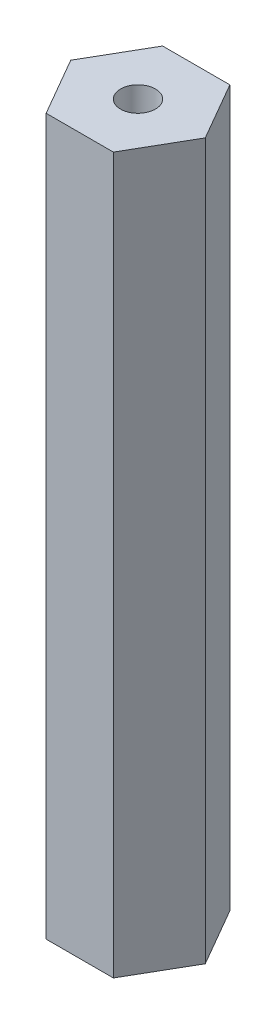
ISO-10303-21;
HEADER;
FILE_DESCRIPTION(('STEP AP214'),'2;1');
FILE_NAME('part.step','',(''),(''),'','','');
FILE_SCHEMA(('AUTOMOTIVE_DESIGN { 1 0 10303 214 1 1 1 1 }'));
ENDSEC;
DATA;
#1=APPLICATION_CONTEXT('core data for automotive mechanical design processes');
#2=APPLICATION_PROTOCOL_DEFINITION('international standard','automotive_design',2000,#1);
#3=PRODUCT_CONTEXT('',#1,'mechanical');
#4=PRODUCT('Part','Part','',(#3));
#5=PRODUCT_RELATED_PRODUCT_CATEGORY('part','',(#4));
#6=PRODUCT_DEFINITION_FORMATION('','',#4);
#7=PRODUCT_DEFINITION_CONTEXT('part definition',#1,'design');
#8=PRODUCT_DEFINITION('design','',#6,#7);
#9=PRODUCT_DEFINITION_SHAPE('','',#8);
#10=(LENGTH_UNIT() NAMED_UNIT(*) SI_UNIT(.MILLI.,.METRE.));
#11=(NAMED_UNIT(*) PLANE_ANGLE_UNIT() SI_UNIT($,.RADIAN.));
#12=(NAMED_UNIT(*) SI_UNIT($,.STERADIAN.) SOLID_ANGLE_UNIT());
#13=UNCERTAINTY_MEASURE_WITH_UNIT(LENGTH_MEASURE(1.E-05),#10,'distance_accuracy_value','');
#14=(GEOMETRIC_REPRESENTATION_CONTEXT(3) GLOBAL_UNCERTAINTY_ASSIGNED_CONTEXT((#13)) GLOBAL_UNIT_ASSIGNED_CONTEXT((#10,
#11,#12)) REPRESENTATION_CONTEXT('',''));
#15=CARTESIAN_POINT('',(0.,0.,0.));
#16=DIRECTION('',(0.,0.,1.));
#17=DIRECTION('',(1.,0.,0.));
#18=AXIS2_PLACEMENT_3D('',#15,#16,#17);
#19=CARTESIAN_POINT('',(1.44337567297409,30.7,2.49999999999997));
#20=DIRECTION('',(-0.866025403784441,0.,-0.499999999999995));
#21=DIRECTION('',(-0.499999999999995,0.,0.866025403784442));
#22=AXIS2_PLACEMENT_3D('',#19,#20,#21);
#23=PLANE('',#22);
#24=DIRECTION('',(0.499999999999995,0.,-0.866025403784442));
#25=VECTOR('',#24,1.);
#26=CARTESIAN_POINT('',(1.44337567297409,0.,2.49999999999997));
#27=LINE('',#26,#25);
#28=CARTESIAN_POINT('',(1.44337567297409,0.,2.49999999999997));
#29=VERTEX_POINT('',#28);
#30=CARTESIAN_POINT('',(2.88675134594812,0.,0.));
#31=VERTEX_POINT('',#30);
#32=EDGE_CURVE('E119',#29,#31,#27,.T.);
#33=ORIENTED_EDGE('',*,*,#32,.T.);
#34=DIRECTION('',(0.,-1.,0.));
#35=VECTOR('',#34,1.);
#36=CARTESIAN_POINT('',(2.88675134594812,30.7,0.));
#37=LINE('',#36,#35);
#38=CARTESIAN_POINT('',(2.88675134594812,30.7,0.));
#39=VERTEX_POINT('',#38);
#40=EDGE_CURVE('E11',#39,#31,#37,.T.);
#41=ORIENTED_EDGE('',*,*,#40,.F.);
#42=DIRECTION('',(0.499999999999995,0.,-0.866025403784442));
#43=VECTOR('',#42,1.);
#44=CARTESIAN_POINT('',(1.44337567297409,30.7,2.49999999999997));
#45=LINE('',#44,#43);
#46=CARTESIAN_POINT('',(1.44337567297409,30.7,2.49999999999997));
#47=VERTEX_POINT('',#46);
#48=EDGE_CURVE('E130',#47,#39,#45,.T.);
#49=ORIENTED_EDGE('',*,*,#48,.F.);
#50=DIRECTION('',(0.,-1.,0.));
#51=VECTOR('',#50,1.);
#52=CARTESIAN_POINT('',(1.44337567297409,30.7,2.49999999999997));
#53=LINE('',#52,#51);
#54=EDGE_CURVE('E115',#47,#29,#53,.T.);
#55=ORIENTED_EDGE('',*,*,#54,.T.);
#56=EDGE_LOOP('',(#33,#41,#49,#55));
#57=FACE_BOUND('',#56,.T.);
#58=ADVANCED_FACE('F35',(#57),#23,.F.);
#59=CARTESIAN_POINT('',(2.88675134594812,30.7,0.));
#60=DIRECTION('',(-0.866025403784438,0.,0.500000000000001));
#61=DIRECTION('',(0.500000000000001,0.,0.866025403784438));
#62=AXIS2_PLACEMENT_3D('',#59,#60,#61);
#63=PLANE('',#62);
#64=DIRECTION('',(-0.500000000000001,0.,-0.866025403784438));
#65=VECTOR('',#64,1.);
#66=CARTESIAN_POINT('',(2.88675134594812,0.,0.));
#67=LINE('',#66,#65);
#68=CARTESIAN_POINT('',(1.44337567297405,0.,-2.49999999999999));
#69=VERTEX_POINT('',#68);
#70=EDGE_CURVE('E122',#31,#69,#67,.T.);
#71=ORIENTED_EDGE('',*,*,#70,.T.);
#72=DIRECTION('',(0.,-1.,0.));
#73=VECTOR('',#72,1.);
#74=CARTESIAN_POINT('',(1.44337567297405,30.7,-2.49999999999999));
#75=LINE('',#74,#73);
#76=CARTESIAN_POINT('',(1.44337567297405,30.7,-2.49999999999999));
#77=VERTEX_POINT('',#76);
#78=EDGE_CURVE('E43',#77,#69,#75,.T.);
#79=ORIENTED_EDGE('',*,*,#78,.F.);
#80=DIRECTION('',(-0.500000000000001,0.,-0.866025403784438));
#81=VECTOR('',#80,1.);
#82=CARTESIAN_POINT('',(2.88675134594812,30.7,0.));
#83=LINE('',#82,#81);
#84=EDGE_CURVE('E88',#39,#77,#83,.T.);
#85=ORIENTED_EDGE('',*,*,#84,.F.);
#86=ORIENTED_EDGE('',*,*,#40,.T.);
#87=EDGE_LOOP('',(#71,#79,#85,#86));
#88=FACE_BOUND('',#87,.T.);
#89=ADVANCED_FACE('F155',(#88),#63,.F.);
#90=CARTESIAN_POINT('',(1.44337567297405,30.7,-2.49999999999999));
#91=DIRECTION('',(0.,0.,1.));
#92=DIRECTION('',(1.,0.,0.));
#93=AXIS2_PLACEMENT_3D('',#90,#91,#92);
#94=PLANE('',#93);
#95=DIRECTION('',(-1.,0.,0.));
#96=VECTOR('',#95,1.);
#97=CARTESIAN_POINT('',(1.44337567297405,0.,-2.49999999999999));
#98=LINE('',#97,#96);
#99=CARTESIAN_POINT('',(-1.44337567297407,0.,-2.49999999999998));
#100=VERTEX_POINT('',#99);
#101=EDGE_CURVE('E125',#69,#100,#98,.T.);
#102=ORIENTED_EDGE('',*,*,#101,.T.);
#103=DIRECTION('',(0.,-1.,0.));
#104=VECTOR('',#103,1.);
#105=CARTESIAN_POINT('',(-1.44337567297407,30.7,-2.49999999999998));
#106=LINE('',#105,#104);
#107=CARTESIAN_POINT('',(-1.44337567297407,30.7,-2.49999999999998));
#108=VERTEX_POINT('',#107);
#109=EDGE_CURVE('E110',#108,#100,#106,.T.);
#110=ORIENTED_EDGE('',*,*,#109,.F.);
#111=DIRECTION('',(-1.,0.,0.));
#112=VECTOR('',#111,1.);
#113=CARTESIAN_POINT('',(1.44337567297405,30.7,-2.49999999999999));
#114=LINE('',#113,#112);
#115=EDGE_CURVE('E101',#77,#108,#114,.T.);
#116=ORIENTED_EDGE('',*,*,#115,.F.);
#117=ORIENTED_EDGE('',*,*,#78,.T.);
#118=EDGE_LOOP('',(#102,#110,#116,#117));
#119=FACE_BOUND('',#118,.T.);
#120=ADVANCED_FACE('F136',(#119),#94,.F.);
#121=CARTESIAN_POINT('',(-1.44337567297407,30.7,-2.49999999999998));
#122=DIRECTION('',(0.866025403784441,0.,0.499999999999995));
#123=DIRECTION('',(0.499999999999995,0.,-0.866025403784441));
#124=AXIS2_PLACEMENT_3D('',#121,#122,#123);
#125=PLANE('',#124);
#126=DIRECTION('',(-0.499999999999995,0.,0.866025403784441));
#127=VECTOR('',#126,1.);
#128=CARTESIAN_POINT('',(-1.44337567297407,0.,-2.49999999999998));
#129=LINE('',#128,#127);
#130=CARTESIAN_POINT('',(-2.88675134594812,0.,0.));
#131=VERTEX_POINT('',#130);
#132=EDGE_CURVE('E109',#100,#131,#129,.T.);
#133=ORIENTED_EDGE('',*,*,#132,.T.);
#134=DIRECTION('',(0.,-1.,0.));
#135=VECTOR('',#134,1.);
#136=CARTESIAN_POINT('',(-2.88675134594812,30.7,0.));
#137=LINE('',#136,#135);
#138=CARTESIAN_POINT('',(-2.88675134594812,30.7,0.));
#139=VERTEX_POINT('',#138);
#140=EDGE_CURVE('E106',#139,#131,#137,.T.);
#141=ORIENTED_EDGE('',*,*,#140,.F.);
#142=DIRECTION('',(-0.499999999999995,0.,0.866025403784441));
#143=VECTOR('',#142,1.);
#144=CARTESIAN_POINT('',(-1.44337567297407,30.7,-2.49999999999998));
#145=LINE('',#144,#143);
#146=EDGE_CURVE('E95',#108,#139,#145,.T.);
#147=ORIENTED_EDGE('',*,*,#146,.F.);
#148=ORIENTED_EDGE('',*,*,#109,.T.);
#149=EDGE_LOOP('',(#133,#141,#147,#148));
#150=FACE_BOUND('',#149,.T.);
#151=ADVANCED_FACE('F107',(#150),#125,.F.);
#152=CARTESIAN_POINT('',(-2.88675134594812,30.7,0.));
#153=DIRECTION('',(0.866025403784435,0.,-0.500000000000007));
#154=DIRECTION('',(-0.500000000000007,0.,-0.866025403784435));
#155=AXIS2_PLACEMENT_3D('',#152,#153,#154);
#156=PLANE('',#155);
#157=DIRECTION('',(0.500000000000007,0.,0.866025403784435));
#158=VECTOR('',#157,1.);
#159=CARTESIAN_POINT('',(-2.88675134594812,0.,0.));
#160=LINE('',#159,#158);
#161=CARTESIAN_POINT('',(-1.44337567297404,0.,2.5));
#162=VERTEX_POINT('',#161);
#163=EDGE_CURVE('E74',#131,#162,#160,.T.);
#164=ORIENTED_EDGE('',*,*,#163,.T.);
#165=DIRECTION('',(0.,-1.,0.));
#166=VECTOR('',#165,1.);
#167=CARTESIAN_POINT('',(-1.44337567297404,30.7,2.5));
#168=LINE('',#167,#166);
#169=CARTESIAN_POINT('',(-1.44337567297404,30.7,2.5));
#170=VERTEX_POINT('',#169);
#171=EDGE_CURVE('E111',#170,#162,#168,.T.);
#172=ORIENTED_EDGE('',*,*,#171,.F.);
#173=DIRECTION('',(0.500000000000007,0.,0.866025403784435));
#174=VECTOR('',#173,1.);
#175=CARTESIAN_POINT('',(-2.88675134594812,30.7,0.));
#176=LINE('',#175,#174);
#177=EDGE_CURVE('E99',#139,#170,#176,.T.);
#178=ORIENTED_EDGE('',*,*,#177,.F.);
#179=ORIENTED_EDGE('',*,*,#140,.T.);
#180=EDGE_LOOP('',(#164,#172,#178,#179));
#181=FACE_BOUND('',#180,.T.);
#182=ADVANCED_FACE('F113',(#181),#156,.F.);
#183=CARTESIAN_POINT('',(-1.44337567297404,30.7,2.5));
#184=DIRECTION('',(0.,0.,-1.));
#185=DIRECTION('',(-1.,0.,0.));
#186=AXIS2_PLACEMENT_3D('',#183,#184,#185);
#187=PLANE('',#186);
#188=DIRECTION('',(1.,0.,0.));
#189=VECTOR('',#188,1.);
#190=CARTESIAN_POINT('',(-1.44337567297404,0.,2.5));
#191=LINE('',#190,#189);
#192=EDGE_CURVE('E80',#162,#29,#191,.T.);
#193=ORIENTED_EDGE('',*,*,#192,.T.);
#194=ORIENTED_EDGE('',*,*,#54,.F.);
#195=DIRECTION('',(1.,0.,0.));
#196=VECTOR('',#195,1.);
#197=CARTESIAN_POINT('',(-1.44337567297404,30.7,2.5));
#198=LINE('',#197,#196);
#199=EDGE_CURVE('E51',#170,#47,#198,.T.);
#200=ORIENTED_EDGE('',*,*,#199,.F.);
#201=ORIENTED_EDGE('',*,*,#171,.T.);
#202=EDGE_LOOP('',(#193,#194,#200,#201));
#203=FACE_BOUND('',#202,.T.);
#204=ADVANCED_FACE('F143',(#203),#187,.F.);
#205=CARTESIAN_POINT('',(0.,30.7,0.));
#206=DIRECTION('',(0.,1.,0.));
#207=DIRECTION('',(0.,0.,1.));
#208=AXIS2_PLACEMENT_3D('',#205,#206,#207);
#209=PLANE('',#208);
#210=CARTESIAN_POINT('',(0.,30.7,0.));
#211=DIRECTION('',(0.,1.,0.));
#212=DIRECTION('',(0.,0.,1.));
#213=AXIS2_PLACEMENT_3D('',#210,#211,#212);
#214=CIRCLE('',#213,0.75);
#215=CARTESIAN_POINT('',(0.,30.7,0.75));
#216=VERTEX_POINT('',#215);
#217=EDGE_CURVE('E210',#216,#216,#214,.T.);
#218=ORIENTED_EDGE('',*,*,#217,.F.);
#219=EDGE_LOOP('',(#218));
#220=FACE_BOUND('',#219,.T.);
#221=ORIENTED_EDGE('',*,*,#48,.T.);
#222=ORIENTED_EDGE('',*,*,#84,.T.);
#223=ORIENTED_EDGE('',*,*,#115,.T.);
#224=ORIENTED_EDGE('',*,*,#146,.T.);
#225=ORIENTED_EDGE('',*,*,#177,.T.);
#226=ORIENTED_EDGE('',*,*,#199,.T.);
#227=EDGE_LOOP('',(#221,#222,#223,#224,#225,#226));
#228=FACE_BOUND('',#227,.T.);
#229=ADVANCED_FACE('F97',(#220,#228),#209,.T.);
#230=CARTESIAN_POINT('',(0.,0.,0.));
#231=DIRECTION('',(0.,1.,0.));
#232=DIRECTION('',(0.,0.,1.));
#233=AXIS2_PLACEMENT_3D('',#230,#231,#232);
#234=PLANE('',#233);
#235=CARTESIAN_POINT('',(0.,0.,0.));
#236=DIRECTION('',(0.,1.,0.));
#237=DIRECTION('',(0.,0.,1.));
#238=AXIS2_PLACEMENT_3D('',#235,#236,#237);
#239=CIRCLE('',#238,0.75);
#240=CARTESIAN_POINT('',(0.,0.,0.75));
#241=VERTEX_POINT('',#240);
#242=EDGE_CURVE('E123',#241,#241,#239,.T.);
#243=ORIENTED_EDGE('',*,*,#242,.T.);
#244=EDGE_LOOP('',(#243));
#245=FACE_BOUND('',#244,.T.);
#246=ORIENTED_EDGE('',*,*,#32,.F.);
#247=ORIENTED_EDGE('',*,*,#192,.F.);
#248=ORIENTED_EDGE('',*,*,#163,.F.);
#249=ORIENTED_EDGE('',*,*,#132,.F.);
#250=ORIENTED_EDGE('',*,*,#101,.F.);
#251=ORIENTED_EDGE('',*,*,#70,.F.);
#252=EDGE_LOOP('',(#246,#247,#248,#249,#250,#251));
#253=FACE_BOUND('',#252,.T.);
#254=ADVANCED_FACE('F139',(#245,#253),#234,.F.);
#255=CARTESIAN_POINT('',(0.,0.,0.));
#256=DIRECTION('',(0.,1.,0.));
#257=DIRECTION('',(0.,0.,1.));
#258=AXIS2_PLACEMENT_3D('',#255,#256,#257);
#259=CYLINDRICAL_SURFACE('',#258,0.75);
#260=ORIENTED_EDGE('',*,*,#242,.F.);
#261=EDGE_LOOP('',(#260));
#262=FACE_BOUND('',#261,.T.);
#263=ORIENTED_EDGE('',*,*,#217,.T.);
#264=EDGE_LOOP('',(#263));
#265=FACE_BOUND('',#264,.T.);
#266=ADVANCED_FACE('F192',(#262,#265),#259,.F.);
#267=CLOSED_SHELL('',(#58,#89,#120,#151,#182,#204,#229,#254,#266));
#268=MANIFOLD_SOLID_BREP('B2',#267);
#269=ADVANCED_BREP_SHAPE_REPRESENTATION('',(#18,#268),#14);
#270=SHAPE_DEFINITION_REPRESENTATION(#9,#269);
ENDSEC;
END-ISO-10303-21;
